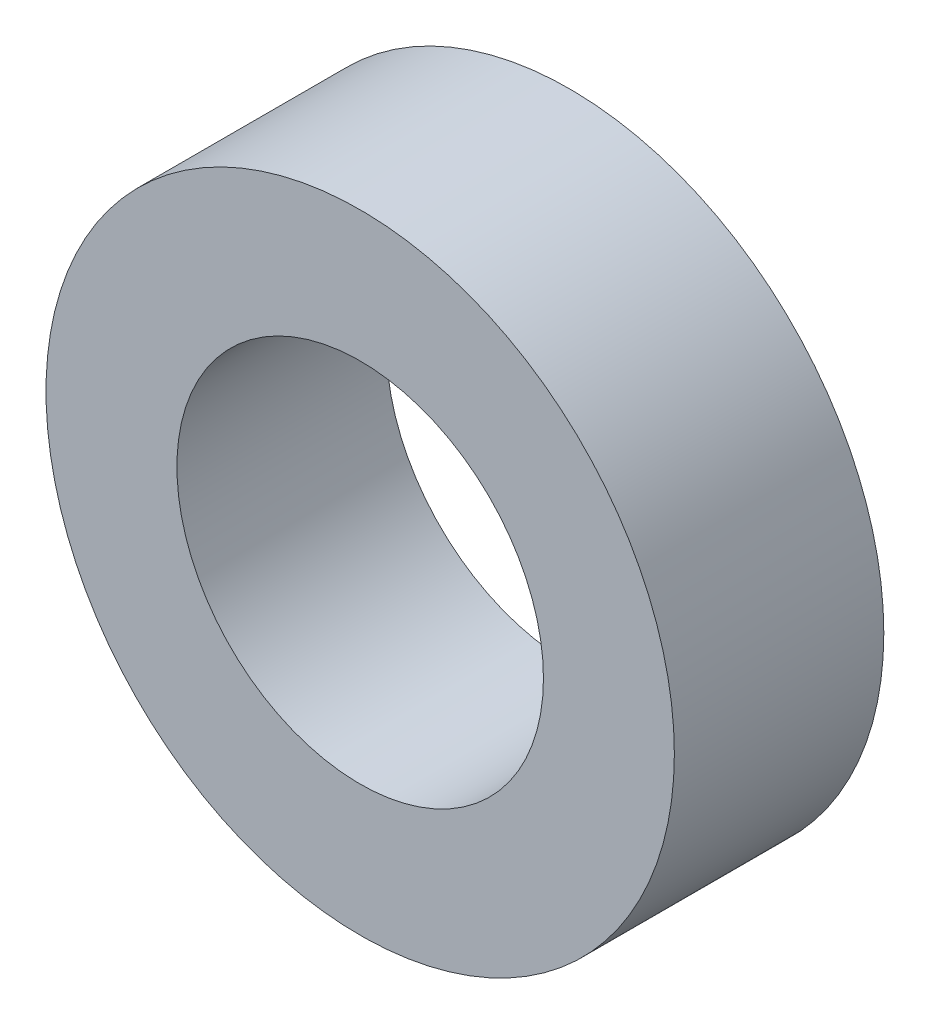
ISO-10303-21;
HEADER;
FILE_DESCRIPTION(('STEP AP214'),'2;1');
FILE_NAME('part.step','',(''),(''),'','','');
FILE_SCHEMA(('AUTOMOTIVE_DESIGN { 1 0 10303 214 1 1 1 1 }'));
ENDSEC;
DATA;
#1=APPLICATION_CONTEXT('core data for automotive mechanical design processes');
#2=APPLICATION_PROTOCOL_DEFINITION('international standard','automotive_design',2000,#1);
#3=PRODUCT_CONTEXT('',#1,'mechanical');
#4=PRODUCT('Part','Part','',(#3));
#5=PRODUCT_RELATED_PRODUCT_CATEGORY('part','',(#4));
#6=PRODUCT_DEFINITION_FORMATION('','',#4);
#7=PRODUCT_DEFINITION_CONTEXT('part definition',#1,'design');
#8=PRODUCT_DEFINITION('design','',#6,#7);
#9=PRODUCT_DEFINITION_SHAPE('','',#8);
#10=(LENGTH_UNIT() NAMED_UNIT(*) SI_UNIT(.MILLI.,.METRE.));
#11=(NAMED_UNIT(*) PLANE_ANGLE_UNIT() SI_UNIT($,.RADIAN.));
#12=(NAMED_UNIT(*) SI_UNIT($,.STERADIAN.) SOLID_ANGLE_UNIT());
#13=UNCERTAINTY_MEASURE_WITH_UNIT(LENGTH_MEASURE(1.E-05),#10,'distance_accuracy_value','');
#14=(GEOMETRIC_REPRESENTATION_CONTEXT(3) GLOBAL_UNCERTAINTY_ASSIGNED_CONTEXT((#13)) GLOBAL_UNIT_ASSIGNED_CONTEXT((#10,
#11,#12)) REPRESENTATION_CONTEXT('',''));
#15=CARTESIAN_POINT('',(0.,0.,0.));
#16=DIRECTION('',(0.,0.,1.));
#17=DIRECTION('',(1.,0.,0.));
#18=AXIS2_PLACEMENT_3D('',#15,#16,#17);
#19=CARTESIAN_POINT('',(0.,0.,2.));
#20=DIRECTION('',(0.,0.,1.));
#21=DIRECTION('',(1.,0.,0.));
#22=AXIS2_PLACEMENT_3D('',#19,#20,#21);
#23=PLANE('',#22);
#24=CARTESIAN_POINT('',(0.,0.,2.));
#25=DIRECTION('',(0.,0.,1.));
#26=DIRECTION('',(1.,0.,0.));
#27=AXIS2_PLACEMENT_3D('',#24,#25,#26);
#28=CIRCLE('',#27,3.);
#29=CARTESIAN_POINT('',(3.,0.,2.));
#30=VERTEX_POINT('',#29);
#31=EDGE_CURVE('E10',#30,#30,#28,.T.);
#32=ORIENTED_EDGE('',*,*,#31,.T.);
#33=EDGE_LOOP('',(#32));
#34=FACE_BOUND('',#33,.T.);
#35=CARTESIAN_POINT('',(0.,0.,2.));
#36=DIRECTION('',(0.,0.,1.));
#37=DIRECTION('',(1.,0.,0.));
#38=AXIS2_PLACEMENT_3D('',#35,#36,#37);
#39=CIRCLE('',#38,1.75);
#40=CARTESIAN_POINT('',(1.75,0.,2.));
#41=VERTEX_POINT('',#40);
#42=EDGE_CURVE('E44',#41,#41,#39,.T.);
#43=ORIENTED_EDGE('',*,*,#42,.F.);
#44=EDGE_LOOP('',(#43));
#45=FACE_BOUND('',#44,.T.);
#46=ADVANCED_FACE('F33',(#34,#45),#23,.T.);
#47=CARTESIAN_POINT('',(0.,0.,0.));
#48=DIRECTION('',(0.,0.,1.));
#49=DIRECTION('',(1.,0.,0.));
#50=AXIS2_PLACEMENT_3D('',#47,#48,#49);
#51=PLANE('',#50);
#52=CARTESIAN_POINT('',(0.,0.,0.));
#53=DIRECTION('',(0.,0.,1.));
#54=DIRECTION('',(1.,0.,0.));
#55=AXIS2_PLACEMENT_3D('',#52,#53,#54);
#56=CIRCLE('',#55,3.);
#57=CARTESIAN_POINT('',(3.,0.,0.));
#58=VERTEX_POINT('',#57);
#59=EDGE_CURVE('E37',#58,#58,#56,.T.);
#60=ORIENTED_EDGE('',*,*,#59,.F.);
#61=EDGE_LOOP('',(#60));
#62=FACE_BOUND('',#61,.T.);
#63=CARTESIAN_POINT('',(0.,0.,0.));
#64=DIRECTION('',(0.,0.,1.));
#65=DIRECTION('',(1.,0.,0.));
#66=AXIS2_PLACEMENT_3D('',#63,#64,#65);
#67=CIRCLE('',#66,1.75);
#68=CARTESIAN_POINT('',(1.75,0.,0.));
#69=VERTEX_POINT('',#68);
#70=EDGE_CURVE('E46',#69,#69,#67,.T.);
#71=ORIENTED_EDGE('',*,*,#70,.T.);
#72=EDGE_LOOP('',(#71));
#73=FACE_BOUND('',#72,.T.);
#74=ADVANCED_FACE('F56',(#62,#73),#51,.F.);
#75=CARTESIAN_POINT('',(0.,0.,2.));
#76=DIRECTION('',(0.,0.,-1.));
#77=DIRECTION('',(-1.,0.,0.));
#78=AXIS2_PLACEMENT_3D('',#75,#76,#77);
#79=CYLINDRICAL_SURFACE('',#78,3.);
#80=ORIENTED_EDGE('',*,*,#31,.F.);
#81=EDGE_LOOP('',(#80));
#82=FACE_BOUND('',#81,.T.);
#83=ORIENTED_EDGE('',*,*,#59,.T.);
#84=EDGE_LOOP('',(#83));
#85=FACE_BOUND('',#84,.T.);
#86=ADVANCED_FACE('F35',(#82,#85),#79,.T.);
#87=CARTESIAN_POINT('',(0.,0.,2.));
#88=DIRECTION('',(0.,0.,-1.));
#89=DIRECTION('',(-1.,0.,0.));
#90=AXIS2_PLACEMENT_3D('',#87,#88,#89);
#91=CYLINDRICAL_SURFACE('',#90,1.75);
#92=ORIENTED_EDGE('',*,*,#42,.T.);
#93=EDGE_LOOP('',(#92));
#94=FACE_BOUND('',#93,.T.);
#95=ORIENTED_EDGE('',*,*,#70,.F.);
#96=EDGE_LOOP('',(#95));
#97=FACE_BOUND('',#96,.T.);
#98=ADVANCED_FACE('F52',(#94,#97),#91,.F.);
#99=CLOSED_SHELL('',(#46,#74,#86,#98));
#100=MANIFOLD_SOLID_BREP('B2',#99);
#101=ADVANCED_BREP_SHAPE_REPRESENTATION('',(#18,#100),#14);
#102=SHAPE_DEFINITION_REPRESENTATION(#9,#101);
ENDSEC;
END-ISO-10303-21;
